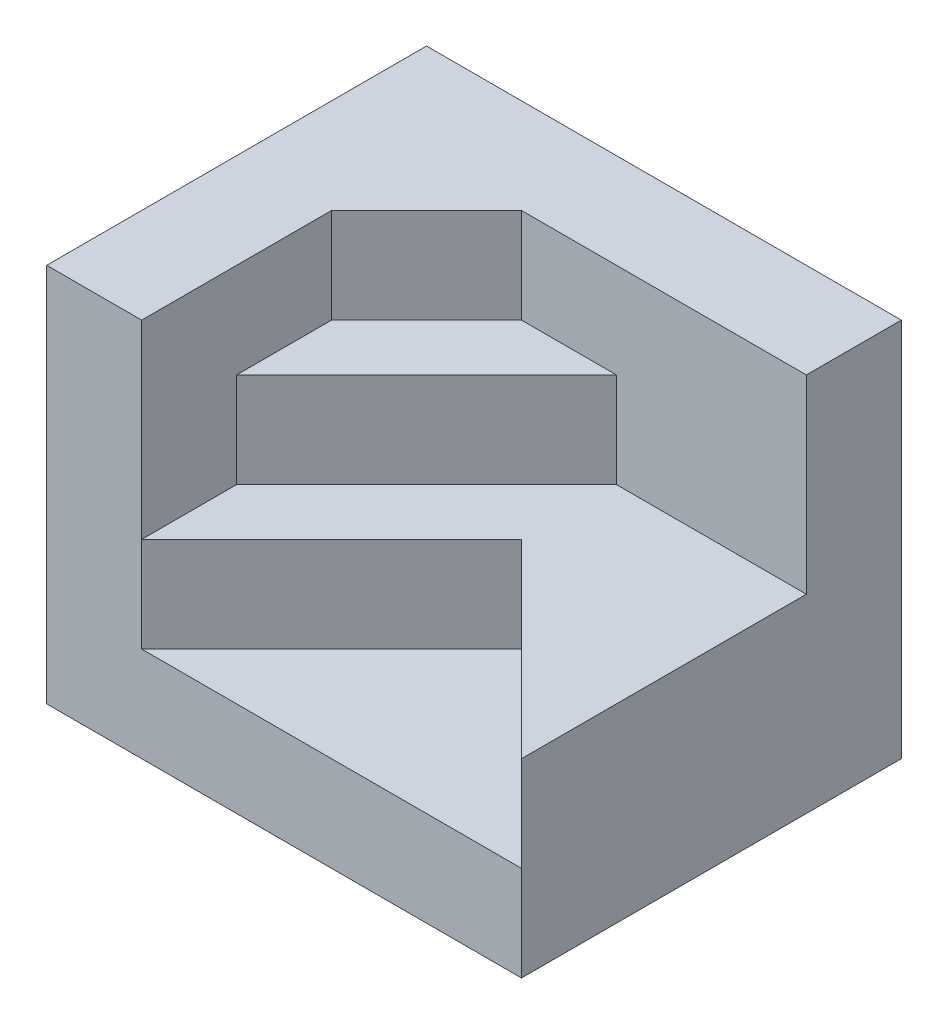
ISO-10303-21;
HEADER;
FILE_DESCRIPTION(('STEP AP214'),'2;1');
FILE_NAME('part.step','',(''),(''),'','','');
FILE_SCHEMA(('AUTOMOTIVE_DESIGN { 1 0 10303 214 1 1 1 1 }'));
ENDSEC;
DATA;
#1=APPLICATION_CONTEXT('core data for automotive mechanical design processes');
#2=APPLICATION_PROTOCOL_DEFINITION('international standard','automotive_design',2000,#1);
#3=PRODUCT_CONTEXT('',#1,'mechanical');
#4=PRODUCT('Part','Part','',(#3));
#5=PRODUCT_RELATED_PRODUCT_CATEGORY('part','',(#4));
#6=PRODUCT_DEFINITION_FORMATION('','',#4);
#7=PRODUCT_DEFINITION_CONTEXT('part definition',#1,'design');
#8=PRODUCT_DEFINITION('design','',#6,#7);
#9=PRODUCT_DEFINITION_SHAPE('','',#8);
#10=(LENGTH_UNIT() NAMED_UNIT(*) SI_UNIT(.MILLI.,.METRE.));
#11=(NAMED_UNIT(*) PLANE_ANGLE_UNIT() SI_UNIT($,.RADIAN.));
#12=(NAMED_UNIT(*) SI_UNIT($,.STERADIAN.) SOLID_ANGLE_UNIT());
#13=UNCERTAINTY_MEASURE_WITH_UNIT(LENGTH_MEASURE(1.E-05),#10,'distance_accuracy_value','');
#14=(GEOMETRIC_REPRESENTATION_CONTEXT(3) GLOBAL_UNCERTAINTY_ASSIGNED_CONTEXT((#13)) GLOBAL_UNIT_ASSIGNED_CONTEXT((#10,
#11,#12)) REPRESENTATION_CONTEXT('',''));
#15=CARTESIAN_POINT('',(0.,0.,0.));
#16=DIRECTION('',(0.,0.,1.));
#17=DIRECTION('',(1.,0.,0.));
#18=AXIS2_PLACEMENT_3D('',#15,#16,#17);
#19=CARTESIAN_POINT('',(0.,0.,-20.));
#20=DIRECTION('',(-1.,0.,0.));
#21=DIRECTION('',(0.,0.,1.));
#22=AXIS2_PLACEMENT_3D('',#19,#20,#21);
#23=PLANE('',#22);
#24=DIRECTION('',(0.,-1.,0.));
#25=VECTOR('',#24,1.);
#26=CARTESIAN_POINT('',(0.,0.,0.));
#27=LINE('',#26,#25);
#28=CARTESIAN_POINT('',(0.,0.,0.));
#29=VERTEX_POINT('',#28);
#30=CARTESIAN_POINT('',(0.,-20.,0.));
#31=VERTEX_POINT('',#30);
#32=EDGE_CURVE('E180',#29,#31,#27,.T.);
#33=ORIENTED_EDGE('',*,*,#32,.F.);
#34=DIRECTION('',(0.,0.,1.));
#35=VECTOR('',#34,1.);
#36=CARTESIAN_POINT('',(0.,0.,-20.));
#37=LINE('',#36,#35);
#38=CARTESIAN_POINT('',(0.,0.,-20.));
#39=VERTEX_POINT('',#38);
#40=EDGE_CURVE('E11',#39,#29,#37,.T.);
#41=ORIENTED_EDGE('',*,*,#40,.F.);
#42=DIRECTION('',(0.,-1.,0.));
#43=VECTOR('',#42,1.);
#44=CARTESIAN_POINT('',(0.,0.,-20.));
#45=LINE('',#44,#43);
#46=CARTESIAN_POINT('',(0.,-20.,-20.));
#47=VERTEX_POINT('',#46);
#48=EDGE_CURVE('E165',#39,#47,#45,.T.);
#49=ORIENTED_EDGE('',*,*,#48,.T.);
#50=DIRECTION('',(0.,0.,1.));
#51=VECTOR('',#50,1.);
#52=CARTESIAN_POINT('',(0.,-20.,-20.));
#53=LINE('',#52,#51);
#54=EDGE_CURVE('E36',#47,#31,#53,.T.);
#55=ORIENTED_EDGE('',*,*,#54,.T.);
#56=EDGE_LOOP('',(#33,#41,#49,#55));
#57=FACE_BOUND('',#56,.T.);
#58=ADVANCED_FACE('F33',(#57),#23,.T.);
#59=CARTESIAN_POINT('',(0.,0.,-20.));
#60=DIRECTION('',(0.,-1.,0.));
#61=DIRECTION('',(0.,0.,-1.));
#62=AXIS2_PLACEMENT_3D('',#59,#60,#61);
#63=PLANE('',#62);
#64=DIRECTION('',(1.,0.,0.));
#65=VECTOR('',#64,1.);
#66=CARTESIAN_POINT('',(0.,0.,-15.));
#67=LINE('',#66,#65);
#68=CARTESIAN_POINT('',(10.,0.,-15.));
#69=VERTEX_POINT('',#68);
#70=CARTESIAN_POINT('',(25.,0.,-15.));
#71=VERTEX_POINT('',#70);
#72=EDGE_CURVE('E189',#69,#71,#67,.T.);
#73=ORIENTED_EDGE('',*,*,#72,.T.);
#74=DIRECTION('',(0.,0.,1.));
#75=VECTOR('',#74,1.);
#76=CARTESIAN_POINT('',(25.,0.,-20.));
#77=LINE('',#76,#75);
#78=CARTESIAN_POINT('',(25.,0.,-20.));
#79=VERTEX_POINT('',#78);
#80=EDGE_CURVE('E41',#79,#71,#77,.T.);
#81=ORIENTED_EDGE('',*,*,#80,.F.);
#82=DIRECTION('',(1.,0.,0.));
#83=VECTOR('',#82,1.);
#84=CARTESIAN_POINT('',(0.,0.,-20.));
#85=LINE('',#84,#83);
#86=EDGE_CURVE('E171',#39,#79,#85,.T.);
#87=ORIENTED_EDGE('',*,*,#86,.F.);
#88=ORIENTED_EDGE('',*,*,#40,.T.);
#89=DIRECTION('',(1.,0.,0.));
#90=VECTOR('',#89,1.);
#91=CARTESIAN_POINT('',(0.,0.,0.));
#92=LINE('',#91,#90);
#93=CARTESIAN_POINT('',(5.,0.,0.));
#94=VERTEX_POINT('',#93);
#95=EDGE_CURVE('E164',#29,#94,#92,.T.);
#96=ORIENTED_EDGE('',*,*,#95,.T.);
#97=DIRECTION('',(0.,0.,1.));
#98=VECTOR('',#97,1.);
#99=CARTESIAN_POINT('',(5.,0.,0.));
#100=LINE('',#99,#98);
#101=CARTESIAN_POINT('',(5.,0.,-10.));
#102=VERTEX_POINT('',#101);
#103=EDGE_CURVE('E348',#102,#94,#100,.T.);
#104=ORIENTED_EDGE('',*,*,#103,.F.);
#105=DIRECTION('',(-0.707106781186548,0.,0.707106781186548));
#106=VECTOR('',#105,1.);
#107=CARTESIAN_POINT('',(-2.5,0.,-2.5));
#108=LINE('',#107,#106);
#109=EDGE_CURVE('E49',#69,#102,#108,.T.);
#110=ORIENTED_EDGE('',*,*,#109,.F.);
#111=EDGE_LOOP('',(#73,#81,#87,#88,#96,#104,#110));
#112=FACE_BOUND('',#111,.T.);
#113=ADVANCED_FACE('F196',(#112),#63,.F.);
#114=CARTESIAN_POINT('',(25.,0.,-20.));
#115=DIRECTION('',(-1.,0.,0.));
#116=DIRECTION('',(0.,-1.,0.));
#117=AXIS2_PLACEMENT_3D('',#114,#115,#116);
#118=PLANE('',#117);
#119=ORIENTED_EDGE('',*,*,#80,.T.);
#120=DIRECTION('',(0.,1.,0.));
#121=VECTOR('',#120,1.);
#122=CARTESIAN_POINT('',(25.,-10.,-15.));
#123=LINE('',#122,#121);
#124=CARTESIAN_POINT('',(25.,-10.,-15.));
#125=VERTEX_POINT('',#124);
#126=EDGE_CURVE('E349',#125,#71,#123,.T.);
#127=ORIENTED_EDGE('',*,*,#126,.F.);
#128=DIRECTION('',(0.,0.,-1.));
#129=VECTOR('',#128,1.);
#130=CARTESIAN_POINT('',(25.,-10.,-15.));
#131=LINE('',#130,#129);
#132=CARTESIAN_POINT('',(25.,-10.,0.));
#133=VERTEX_POINT('',#132);
#134=EDGE_CURVE('E163',#133,#125,#131,.T.);
#135=ORIENTED_EDGE('',*,*,#134,.F.);
#136=DIRECTION('',(0.,-1.,0.));
#137=VECTOR('',#136,1.);
#138=CARTESIAN_POINT('',(25.,0.,0.));
#139=LINE('',#138,#137);
#140=CARTESIAN_POINT('',(25.,-15.,0.));
#141=VERTEX_POINT('',#140);
#142=EDGE_CURVE('E133',#133,#141,#139,.T.);
#143=ORIENTED_EDGE('',*,*,#142,.T.);
#144=CARTESIAN_POINT('',(25.,-20.,0.));
#145=VERTEX_POINT('',#144);
#146=EDGE_CURVE('E150',#141,#145,#139,.T.);
#147=ORIENTED_EDGE('',*,*,#146,.T.);
#148=DIRECTION('',(0.,0.,1.));
#149=VECTOR('',#148,1.);
#150=CARTESIAN_POINT('',(25.,-20.,-20.));
#151=LINE('',#150,#149);
#152=CARTESIAN_POINT('',(25.,-20.,-20.));
#153=VERTEX_POINT('',#152);
#154=EDGE_CURVE('E170',#153,#145,#151,.T.);
#155=ORIENTED_EDGE('',*,*,#154,.F.);
#156=DIRECTION('',(0.,-1.,0.));
#157=VECTOR('',#156,1.);
#158=CARTESIAN_POINT('',(25.,0.,-20.));
#159=LINE('',#158,#157);
#160=EDGE_CURVE('E172',#79,#153,#159,.T.);
#161=ORIENTED_EDGE('',*,*,#160,.F.);
#162=EDGE_LOOP('',(#119,#127,#135,#143,#147,#155,#161));
#163=FACE_BOUND('',#162,.T.);
#164=ADVANCED_FACE('F160',(#163),#118,.F.);
#165=CARTESIAN_POINT('',(0.,-20.,-20.));
#166=DIRECTION('',(0.,-1.,0.));
#167=DIRECTION('',(0.,0.,-1.));
#168=AXIS2_PLACEMENT_3D('',#165,#166,#167);
#169=PLANE('',#168);
#170=DIRECTION('',(1.,0.,0.));
#171=VECTOR('',#170,1.);
#172=CARTESIAN_POINT('',(0.,-20.,0.));
#173=LINE('',#172,#171);
#174=EDGE_CURVE('E153',#31,#145,#173,.T.);
#175=ORIENTED_EDGE('',*,*,#174,.F.);
#176=ORIENTED_EDGE('',*,*,#54,.F.);
#177=DIRECTION('',(1.,0.,0.));
#178=VECTOR('',#177,1.);
#179=CARTESIAN_POINT('',(0.,-20.,-20.));
#180=LINE('',#179,#178);
#181=EDGE_CURVE('E177',#47,#153,#180,.T.);
#182=ORIENTED_EDGE('',*,*,#181,.T.);
#183=ORIENTED_EDGE('',*,*,#154,.T.);
#184=EDGE_LOOP('',(#175,#176,#182,#183));
#185=FACE_BOUND('',#184,.T.);
#186=ADVANCED_FACE('F192',(#185),#169,.T.);
#187=CARTESIAN_POINT('',(0.,0.,-20.));
#188=DIRECTION('',(0.,0.,1.));
#189=DIRECTION('',(1.,0.,0.));
#190=AXIS2_PLACEMENT_3D('',#187,#188,#189);
#191=PLANE('',#190);
#192=ORIENTED_EDGE('',*,*,#48,.F.);
#193=ORIENTED_EDGE('',*,*,#86,.T.);
#194=ORIENTED_EDGE('',*,*,#160,.T.);
#195=ORIENTED_EDGE('',*,*,#181,.F.);
#196=EDGE_LOOP('',(#192,#193,#194,#195));
#197=FACE_BOUND('',#196,.T.);
#198=ADVANCED_FACE('F193',(#197),#191,.F.);
#199=CARTESIAN_POINT('',(0.,0.,0.));
#200=DIRECTION('',(0.,0.,1.));
#201=DIRECTION('',(1.,0.,0.));
#202=AXIS2_PLACEMENT_3D('',#199,#200,#201);
#203=PLANE('',#202);
#204=DIRECTION('',(0.,1.,0.));
#205=VECTOR('',#204,1.);
#206=CARTESIAN_POINT('',(5.,-15.,0.));
#207=LINE('',#206,#205);
#208=CARTESIAN_POINT('',(5.,-15.,0.));
#209=VERTEX_POINT('',#208);
#210=CARTESIAN_POINT('',(5.,-10.,0.));
#211=VERTEX_POINT('',#210);
#212=EDGE_CURVE('E334',#209,#211,#207,.T.);
#213=ORIENTED_EDGE('',*,*,#212,.T.);
#214=DIRECTION('',(0.,1.,0.));
#215=VECTOR('',#214,1.);
#216=CARTESIAN_POINT('',(5.,-10.,0.));
#217=LINE('',#216,#215);
#218=EDGE_CURVE('E340',#211,#94,#217,.T.);
#219=ORIENTED_EDGE('',*,*,#218,.T.);
#220=ORIENTED_EDGE('',*,*,#95,.F.);
#221=ORIENTED_EDGE('',*,*,#32,.T.);
#222=ORIENTED_EDGE('',*,*,#174,.T.);
#223=ORIENTED_EDGE('',*,*,#146,.F.);
#224=DIRECTION('',(1.,0.,0.));
#225=VECTOR('',#224,1.);
#226=CARTESIAN_POINT('',(5.,-15.,0.));
#227=LINE('',#226,#225);
#228=EDGE_CURVE('E140',#209,#141,#227,.T.);
#229=ORIENTED_EDGE('',*,*,#228,.F.);
#230=EDGE_LOOP('',(#213,#219,#220,#221,#222,#223,#229));
#231=FACE_BOUND('',#230,.T.);
#232=ADVANCED_FACE('F151',(#231),#203,.T.);
#233=CARTESIAN_POINT('',(-2.5,-5.,-2.5));
#234=DIRECTION('',(-0.707106781186548,0.,-0.707106781186548));
#235=DIRECTION('',(-0.707106781186548,0.,0.707106781186548));
#236=AXIS2_PLACEMENT_3D('',#233,#234,#235);
#237=PLANE('',#236);
#238=ORIENTED_EDGE('',*,*,#109,.T.);
#239=DIRECTION('',(0.,1.,0.));
#240=VECTOR('',#239,1.);
#241=CARTESIAN_POINT('',(5.,-5.,-10.));
#242=LINE('',#241,#240);
#243=CARTESIAN_POINT('',(5.,-5.,-10.));
#244=VERTEX_POINT('',#243);
#245=EDGE_CURVE('E182',#244,#102,#242,.T.);
#246=ORIENTED_EDGE('',*,*,#245,.F.);
#247=DIRECTION('',(-0.707106781186548,0.,0.707106781186548));
#248=VECTOR('',#247,1.);
#249=CARTESIAN_POINT('',(-2.5,-5.,-2.5));
#250=LINE('',#249,#248);
#251=CARTESIAN_POINT('',(10.,-5.,-15.));
#252=VERTEX_POINT('',#251);
#253=EDGE_CURVE('E365',#252,#244,#250,.T.);
#254=ORIENTED_EDGE('',*,*,#253,.F.);
#255=DIRECTION('',(0.,1.,0.));
#256=VECTOR('',#255,1.);
#257=CARTESIAN_POINT('',(10.,-5.,-15.));
#258=LINE('',#257,#256);
#259=EDGE_CURVE('E181',#252,#69,#258,.T.);
#260=ORIENTED_EDGE('',*,*,#259,.T.);
#261=EDGE_LOOP('',(#238,#246,#254,#260));
#262=FACE_BOUND('',#261,.T.);
#263=ADVANCED_FACE('F214',(#262),#237,.F.);
#264=CARTESIAN_POINT('',(0.,-5.,-15.));
#265=DIRECTION('',(0.,0.,1.));
#266=DIRECTION('',(1.,0.,0.));
#267=AXIS2_PLACEMENT_3D('',#264,#265,#266);
#268=PLANE('',#267);
#269=ORIENTED_EDGE('',*,*,#72,.F.);
#270=ORIENTED_EDGE('',*,*,#259,.F.);
#271=DIRECTION('',(1.,0.,0.));
#272=VECTOR('',#271,1.);
#273=CARTESIAN_POINT('',(0.,-5.,-15.));
#274=LINE('',#273,#272);
#275=CARTESIAN_POINT('',(15.,-5.,-15.));
#276=VERTEX_POINT('',#275);
#277=EDGE_CURVE('E186',#252,#276,#274,.T.);
#278=ORIENTED_EDGE('',*,*,#277,.T.);
#279=DIRECTION('',(0.,1.,0.));
#280=VECTOR('',#279,1.);
#281=CARTESIAN_POINT('',(15.,-10.,-15.));
#282=LINE('',#281,#280);
#283=CARTESIAN_POINT('',(15.,-10.,-15.));
#284=VERTEX_POINT('',#283);
#285=EDGE_CURVE('E356',#284,#276,#282,.T.);
#286=ORIENTED_EDGE('',*,*,#285,.F.);
#287=DIRECTION('',(-1.,0.,0.));
#288=VECTOR('',#287,1.);
#289=CARTESIAN_POINT('',(15.,-10.,-15.));
#290=LINE('',#289,#288);
#291=EDGE_CURVE('E341',#125,#284,#290,.T.);
#292=ORIENTED_EDGE('',*,*,#291,.F.);
#293=ORIENTED_EDGE('',*,*,#126,.T.);
#294=EDGE_LOOP('',(#269,#270,#278,#286,#292,#293));
#295=FACE_BOUND('',#294,.T.);
#296=ADVANCED_FACE('F218',(#295),#268,.T.);
#297=CARTESIAN_POINT('',(5.,-5.,0.));
#298=DIRECTION('',(-1.,0.,0.));
#299=DIRECTION('',(0.,0.,1.));
#300=AXIS2_PLACEMENT_3D('',#297,#298,#299);
#301=PLANE('',#300);
#302=ORIENTED_EDGE('',*,*,#103,.T.);
#303=ORIENTED_EDGE('',*,*,#218,.F.);
#304=DIRECTION('',(0.,0.,1.));
#305=VECTOR('',#304,1.);
#306=CARTESIAN_POINT('',(5.,-10.,0.));
#307=LINE('',#306,#305);
#308=CARTESIAN_POINT('',(5.,-10.,-5.));
#309=VERTEX_POINT('',#308);
#310=EDGE_CURVE('E345',#309,#211,#307,.T.);
#311=ORIENTED_EDGE('',*,*,#310,.F.);
#312=DIRECTION('',(0.,1.,0.));
#313=VECTOR('',#312,1.);
#314=CARTESIAN_POINT('',(5.,-10.,-5.));
#315=LINE('',#314,#313);
#316=CARTESIAN_POINT('',(5.,-5.,-5.));
#317=VERTEX_POINT('',#316);
#318=EDGE_CURVE('E350',#309,#317,#315,.T.);
#319=ORIENTED_EDGE('',*,*,#318,.T.);
#320=DIRECTION('',(0.,0.,1.));
#321=VECTOR('',#320,1.);
#322=CARTESIAN_POINT('',(5.,-5.,0.));
#323=LINE('',#322,#321);
#324=EDGE_CURVE('E368',#244,#317,#323,.T.);
#325=ORIENTED_EDGE('',*,*,#324,.F.);
#326=ORIENTED_EDGE('',*,*,#245,.T.);
#327=EDGE_LOOP('',(#302,#303,#311,#319,#325,#326));
#328=FACE_BOUND('',#327,.T.);
#329=ADVANCED_FACE('F219',(#328),#301,.F.);
#330=CARTESIAN_POINT('',(0.,-5.,0.));
#331=DIRECTION('',(0.,1.,0.));
#332=DIRECTION('',(0.,0.,1.));
#333=AXIS2_PLACEMENT_3D('',#330,#331,#332);
#334=PLANE('',#333);
#335=ORIENTED_EDGE('',*,*,#253,.T.);
#336=ORIENTED_EDGE('',*,*,#324,.T.);
#337=DIRECTION('',(-0.707106781186548,0.,0.707106781186548));
#338=VECTOR('',#337,1.);
#339=CARTESIAN_POINT('',(0.,-5.,0.));
#340=LINE('',#339,#338);
#341=EDGE_CURVE('E371',#276,#317,#340,.T.);
#342=ORIENTED_EDGE('',*,*,#341,.F.);
#343=ORIENTED_EDGE('',*,*,#277,.F.);
#344=EDGE_LOOP('',(#335,#336,#342,#343));
#345=FACE_BOUND('',#344,.T.);
#346=ADVANCED_FACE('F222',(#345),#334,.T.);
#347=CARTESIAN_POINT('',(15.,-10.,-15.));
#348=DIRECTION('',(-0.707106781186548,0.,-0.707106781186548));
#349=DIRECTION('',(-0.707106781186548,0.,0.707106781186548));
#350=AXIS2_PLACEMENT_3D('',#347,#348,#349);
#351=PLANE('',#350);
#352=ORIENTED_EDGE('',*,*,#341,.T.);
#353=ORIENTED_EDGE('',*,*,#318,.F.);
#354=DIRECTION('',(-0.707106781186548,0.,0.707106781186548));
#355=VECTOR('',#354,1.);
#356=CARTESIAN_POINT('',(15.,-10.,-15.));
#357=LINE('',#356,#355);
#358=EDGE_CURVE('E354',#284,#309,#357,.T.);
#359=ORIENTED_EDGE('',*,*,#358,.F.);
#360=ORIENTED_EDGE('',*,*,#285,.T.);
#361=EDGE_LOOP('',(#352,#353,#359,#360));
#362=FACE_BOUND('',#361,.T.);
#363=ADVANCED_FACE('F229',(#362),#351,.F.);
#364=CARTESIAN_POINT('',(0.,-10.,0.));
#365=DIRECTION('',(0.,-1.,0.));
#366=DIRECTION('',(0.,0.,-1.));
#367=AXIS2_PLACEMENT_3D('',#364,#365,#366);
#368=PLANE('',#367);
#369=ORIENTED_EDGE('',*,*,#310,.T.);
#370=DIRECTION('',(-0.707106781186548,0.,0.707106781186546));
#371=VECTOR('',#370,1.);
#372=CARTESIAN_POINT('',(5.,-10.,0.));
#373=LINE('',#372,#371);
#374=CARTESIAN_POINT('',(15.,-10.,-10.));
#375=VERTEX_POINT('',#374);
#376=EDGE_CURVE('E147',#375,#211,#373,.T.);
#377=ORIENTED_EDGE('',*,*,#376,.F.);
#378=DIRECTION('',(-0.707106781186547,0.,-0.707106781186549));
#379=VECTOR('',#378,1.);
#380=CARTESIAN_POINT('',(15.,-10.,-10.));
#381=LINE('',#380,#379);
#382=EDGE_CURVE('E336',#133,#375,#381,.T.);
#383=ORIENTED_EDGE('',*,*,#382,.F.);
#384=ORIENTED_EDGE('',*,*,#134,.T.);
#385=ORIENTED_EDGE('',*,*,#291,.T.);
#386=ORIENTED_EDGE('',*,*,#358,.T.);
#387=EDGE_LOOP('',(#369,#377,#383,#384,#385,#386));
#388=FACE_BOUND('',#387,.T.);
#389=ADVANCED_FACE('F233',(#388),#368,.F.);
#390=CARTESIAN_POINT('',(5.,-15.,0.));
#391=DIRECTION('',(-0.707106781186546,0.,-0.707106781186548));
#392=DIRECTION('',(-0.707106781186549,0.,0.707106781186547));
#393=AXIS2_PLACEMENT_3D('',#390,#391,#392);
#394=PLANE('',#393);
#395=ORIENTED_EDGE('',*,*,#376,.T.);
#396=ORIENTED_EDGE('',*,*,#212,.F.);
#397=DIRECTION('',(-0.707106781186548,0.,0.707106781186546));
#398=VECTOR('',#397,1.);
#399=CARTESIAN_POINT('',(5.,-15.,0.));
#400=LINE('',#399,#398);
#401=CARTESIAN_POINT('',(15.,-15.,-10.));
#402=VERTEX_POINT('',#401);
#403=EDGE_CURVE('E139',#402,#209,#400,.T.);
#404=ORIENTED_EDGE('',*,*,#403,.F.);
#405=DIRECTION('',(0.,1.,0.));
#406=VECTOR('',#405,1.);
#407=CARTESIAN_POINT('',(15.,-15.,-10.));
#408=LINE('',#407,#406);
#409=EDGE_CURVE('E135',#402,#375,#408,.T.);
#410=ORIENTED_EDGE('',*,*,#409,.T.);
#411=EDGE_LOOP('',(#395,#396,#404,#410));
#412=FACE_BOUND('',#411,.T.);
#413=ADVANCED_FACE('F237',(#412),#394,.F.);
#414=CARTESIAN_POINT('',(15.,-15.,-10.));
#415=DIRECTION('',(0.707106781186549,0.,-0.707106781186547));
#416=DIRECTION('',(-0.707106781186547,0.,-0.707106781186549));
#417=AXIS2_PLACEMENT_3D('',#414,#415,#416);
#418=PLANE('',#417);
#419=ORIENTED_EDGE('',*,*,#382,.T.);
#420=ORIENTED_EDGE('',*,*,#409,.F.);
#421=DIRECTION('',(-0.707106781186547,0.,-0.707106781186549));
#422=VECTOR('',#421,1.);
#423=CARTESIAN_POINT('',(15.,-15.,-10.));
#424=LINE('',#423,#422);
#425=EDGE_CURVE('E128',#141,#402,#424,.T.);
#426=ORIENTED_EDGE('',*,*,#425,.F.);
#427=ORIENTED_EDGE('',*,*,#142,.F.);
#428=EDGE_LOOP('',(#419,#420,#426,#427));
#429=FACE_BOUND('',#428,.T.);
#430=ADVANCED_FACE('F131',(#429),#418,.F.);
#431=CARTESIAN_POINT('',(0.,-15.,0.));
#432=DIRECTION('',(0.,-1.,0.));
#433=DIRECTION('',(0.,0.,-1.));
#434=AXIS2_PLACEMENT_3D('',#431,#432,#433);
#435=PLANE('',#434);
#436=ORIENTED_EDGE('',*,*,#228,.T.);
#437=ORIENTED_EDGE('',*,*,#425,.T.);
#438=ORIENTED_EDGE('',*,*,#403,.T.);
#439=EDGE_LOOP('',(#436,#437,#438));
#440=FACE_BOUND('',#439,.T.);
#441=ADVANCED_FACE('F144',(#440),#435,.F.);
#442=CLOSED_SHELL('',(#58,#113,#164,#186,#198,#232,#263,#296,#329,#346,#363,#389,#413,#430,#441));
#443=MANIFOLD_SOLID_BREP('B2',#442);
#444=ADVANCED_BREP_SHAPE_REPRESENTATION('',(#18,#443),#14);
#445=SHAPE_DEFINITION_REPRESENTATION(#9,#444);
ENDSEC;
END-ISO-10303-21;
